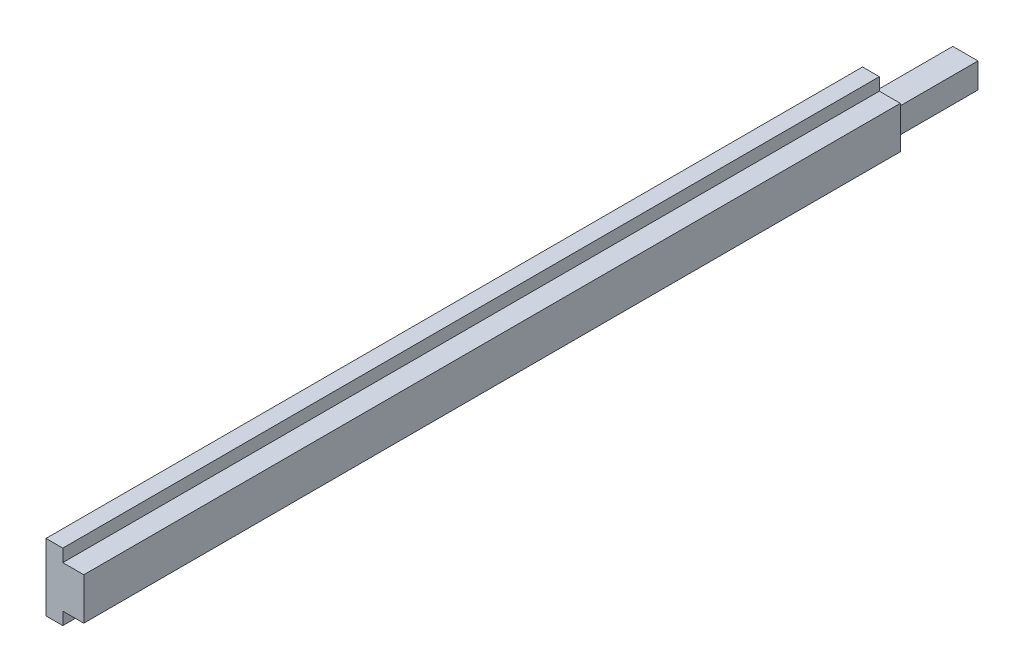
ISO-10303-21;
HEADER;
FILE_DESCRIPTION(('STEP AP214'),'2;1');
FILE_NAME('part.step','',(''),(''),'','','');
FILE_SCHEMA(('AUTOMOTIVE_DESIGN { 1 0 10303 214 1 1 1 1 }'));
ENDSEC;
DATA;
#1=APPLICATION_CONTEXT('core data for automotive mechanical design processes');
#2=APPLICATION_PROTOCOL_DEFINITION('international standard','automotive_design',2000,#1);
#3=PRODUCT_CONTEXT('',#1,'mechanical');
#4=PRODUCT('Part','Part','',(#3));
#5=PRODUCT_RELATED_PRODUCT_CATEGORY('part','',(#4));
#6=PRODUCT_DEFINITION_FORMATION('','',#4);
#7=PRODUCT_DEFINITION_CONTEXT('part definition',#1,'design');
#8=PRODUCT_DEFINITION('design','',#6,#7);
#9=PRODUCT_DEFINITION_SHAPE('','',#8);
#10=(LENGTH_UNIT() NAMED_UNIT(*) SI_UNIT(.MILLI.,.METRE.));
#11=(NAMED_UNIT(*) PLANE_ANGLE_UNIT() SI_UNIT($,.RADIAN.));
#12=(NAMED_UNIT(*) SI_UNIT($,.STERADIAN.) SOLID_ANGLE_UNIT());
#13=UNCERTAINTY_MEASURE_WITH_UNIT(LENGTH_MEASURE(1.E-05),#10,'distance_accuracy_value','');
#14=(GEOMETRIC_REPRESENTATION_CONTEXT(3) GLOBAL_UNCERTAINTY_ASSIGNED_CONTEXT((#13)) GLOBAL_UNIT_ASSIGNED_CONTEXT((#10,
#11,#12)) REPRESENTATION_CONTEXT('',''));
#15=CARTESIAN_POINT('',(0.,0.,0.));
#16=DIRECTION('',(0.,0.,1.));
#17=DIRECTION('',(1.,0.,0.));
#18=AXIS2_PLACEMENT_3D('',#15,#16,#17);
#19=CARTESIAN_POINT('',(0.,0.,-194.5));
#20=DIRECTION('',(0.,0.,1.));
#21=DIRECTION('',(1.,0.,0.));
#22=AXIS2_PLACEMENT_3D('',#19,#20,#21);
#23=PLANE('',#22);
#24=DIRECTION('',(1.,0.,0.));
#25=VECTOR('',#24,1.);
#26=CARTESIAN_POINT('',(0.,5.,-194.5));
#27=LINE('',#26,#25);
#28=CARTESIAN_POINT('',(2.,5.,-194.5));
#29=VERTEX_POINT('',#28);
#30=CARTESIAN_POINT('',(7.,5.,-194.5));
#31=VERTEX_POINT('',#30);
#32=EDGE_CURVE('E162',#29,#31,#27,.T.);
#33=ORIENTED_EDGE('',*,*,#32,.T.);
#34=DIRECTION('',(0.,1.,0.));
#35=VECTOR('',#34,1.);
#36=CARTESIAN_POINT('',(7.,0.,-194.5));
#37=LINE('',#36,#35);
#38=CARTESIAN_POINT('',(7.,-5.,-194.5));
#39=VERTEX_POINT('',#38);
#40=EDGE_CURVE('E179',#39,#31,#37,.T.);
#41=ORIENTED_EDGE('',*,*,#40,.F.);
#42=DIRECTION('',(1.,0.,0.));
#43=VECTOR('',#42,1.);
#44=CARTESIAN_POINT('',(0.,-5.,-194.5));
#45=LINE('',#44,#43);
#46=CARTESIAN_POINT('',(2.,-5.,-194.5));
#47=VERTEX_POINT('',#46);
#48=EDGE_CURVE('E176',#47,#39,#45,.T.);
#49=ORIENTED_EDGE('',*,*,#48,.F.);
#50=DIRECTION('',(0.,1.,0.));
#51=VECTOR('',#50,1.);
#52=CARTESIAN_POINT('',(2.,0.,-194.5));
#53=LINE('',#52,#51);
#54=CARTESIAN_POINT('',(2.,-8.,-194.5));
#55=VERTEX_POINT('',#54);
#56=EDGE_CURVE('E169',#55,#47,#53,.T.);
#57=ORIENTED_EDGE('',*,*,#56,.F.);
#58=DIRECTION('',(-1.,0.,0.));
#59=VECTOR('',#58,1.);
#60=CARTESIAN_POINT('',(0.,-8.,-194.5));
#61=LINE('',#60,#59);
#62=CARTESIAN_POINT('',(-2.,-8.,-194.5));
#63=VERTEX_POINT('',#62);
#64=EDGE_CURVE('E174',#55,#63,#61,.T.);
#65=ORIENTED_EDGE('',*,*,#64,.T.);
#66=DIRECTION('',(0.,1.,0.));
#67=VECTOR('',#66,1.);
#68=CARTESIAN_POINT('',(-2.,0.,-194.5));
#69=LINE('',#68,#67);
#70=CARTESIAN_POINT('',(-2.,8.,-194.5));
#71=VERTEX_POINT('',#70);
#72=EDGE_CURVE('E172',#63,#71,#69,.T.);
#73=ORIENTED_EDGE('',*,*,#72,.T.);
#74=DIRECTION('',(-1.,0.,0.));
#75=VECTOR('',#74,1.);
#76=CARTESIAN_POINT('',(0.,8.,-194.5));
#77=LINE('',#76,#75);
#78=CARTESIAN_POINT('',(2.,8.,-194.5));
#79=VERTEX_POINT('',#78);
#80=EDGE_CURVE('E168',#79,#71,#77,.T.);
#81=ORIENTED_EDGE('',*,*,#80,.F.);
#82=EDGE_CURVE('E164',#29,#79,#53,.T.);
#83=ORIENTED_EDGE('',*,*,#82,.F.);
#84=EDGE_LOOP('',(#33,#41,#49,#57,#65,#73,#81,#83));
#85=FACE_BOUND('',#84,.T.);
#86=DIRECTION('',(0.,-1.,0.));
#87=VECTOR('',#86,1.);
#88=CARTESIAN_POINT('',(5.5,3.,-194.5));
#89=LINE('',#88,#87);
#90=CARTESIAN_POINT('',(5.5,3.,-194.5));
#91=VERTEX_POINT('',#90);
#92=CARTESIAN_POINT('',(5.5,-3.,-194.5));
#93=VERTEX_POINT('',#92);
#94=EDGE_CURVE('E60',#91,#93,#89,.T.);
#95=ORIENTED_EDGE('',*,*,#94,.F.);
#96=DIRECTION('',(1.,0.,0.));
#97=VECTOR('',#96,1.);
#98=CARTESIAN_POINT('',(-0.5,3.,-194.5));
#99=LINE('',#98,#97);
#100=CARTESIAN_POINT('',(-0.5,3.,-194.5));
#101=VERTEX_POINT('',#100);
#102=EDGE_CURVE('E64',#101,#91,#99,.T.);
#103=ORIENTED_EDGE('',*,*,#102,.F.);
#104=DIRECTION('',(0.,1.,0.));
#105=VECTOR('',#104,1.);
#106=CARTESIAN_POINT('',(-0.5,3.,-194.5));
#107=LINE('',#106,#105);
#108=CARTESIAN_POINT('',(-0.500000000000001,-3.,-194.5));
#109=VERTEX_POINT('',#108);
#110=EDGE_CURVE('E353',#109,#101,#107,.T.);
#111=ORIENTED_EDGE('',*,*,#110,.F.);
#112=DIRECTION('',(-1.,0.,0.));
#113=VECTOR('',#112,1.);
#114=CARTESIAN_POINT('',(-0.500000000000001,-3.,-194.5));
#115=LINE('',#114,#113);
#116=EDGE_CURVE('E359',#93,#109,#115,.T.);
#117=ORIENTED_EDGE('',*,*,#116,.F.);
#118=EDGE_LOOP('',(#95,#103,#111,#117));
#119=FACE_BOUND('',#118,.T.);
#120=ADVANCED_FACE('F43',(#85,#119),#23,.F.);
#121=CARTESIAN_POINT('',(0.,5.,-194.5));
#122=DIRECTION('',(0.,-1.,0.));
#123=DIRECTION('',(1.,0.,0.));
#124=AXIS2_PLACEMENT_3D('',#121,#122,#123);
#125=PLANE('',#124);
#126=DIRECTION('',(1.,0.,0.));
#127=VECTOR('',#126,1.);
#128=CARTESIAN_POINT('',(0.,5.,0.));
#129=LINE('',#128,#127);
#130=CARTESIAN_POINT('',(2.,5.,0.));
#131=VERTEX_POINT('',#130);
#132=CARTESIAN_POINT('',(7.,5.,0.));
#133=VERTEX_POINT('',#132);
#134=EDGE_CURVE('E153',#131,#133,#129,.T.);
#135=ORIENTED_EDGE('',*,*,#134,.T.);
#136=DIRECTION('',(0.,0.,1.));
#137=VECTOR('',#136,1.);
#138=CARTESIAN_POINT('',(7.,5.,-194.5));
#139=LINE('',#138,#137);
#140=EDGE_CURVE('E11',#31,#133,#139,.T.);
#141=ORIENTED_EDGE('',*,*,#140,.F.);
#142=ORIENTED_EDGE('',*,*,#32,.F.);
#143=DIRECTION('',(0.,0.,1.));
#144=VECTOR('',#143,1.);
#145=CARTESIAN_POINT('',(2.,5.,-194.5));
#146=LINE('',#145,#144);
#147=EDGE_CURVE('E47',#29,#131,#146,.T.);
#148=ORIENTED_EDGE('',*,*,#147,.T.);
#149=EDGE_LOOP('',(#135,#141,#142,#148));
#150=FACE_BOUND('',#149,.T.);
#151=ADVANCED_FACE('F45',(#150),#125,.F.);
#152=CARTESIAN_POINT('',(7.,0.,-194.5));
#153=DIRECTION('',(1.,0.,0.));
#154=DIRECTION('',(0.,0.,-1.));
#155=AXIS2_PLACEMENT_3D('',#152,#153,#154);
#156=PLANE('',#155);
#157=DIRECTION('',(0.,1.,0.));
#158=VECTOR('',#157,1.);
#159=CARTESIAN_POINT('',(7.,0.,0.));
#160=LINE('',#159,#158);
#161=CARTESIAN_POINT('',(7.,-5.,0.));
#162=VERTEX_POINT('',#161);
#163=EDGE_CURVE('E165',#162,#133,#160,.T.);
#164=ORIENTED_EDGE('',*,*,#163,.F.);
#165=DIRECTION('',(0.,0.,1.));
#166=VECTOR('',#165,1.);
#167=CARTESIAN_POINT('',(7.,-5.,-194.5));
#168=LINE('',#167,#166);
#169=EDGE_CURVE('E52',#39,#162,#168,.T.);
#170=ORIENTED_EDGE('',*,*,#169,.F.);
#171=ORIENTED_EDGE('',*,*,#40,.T.);
#172=ORIENTED_EDGE('',*,*,#140,.T.);
#173=EDGE_LOOP('',(#164,#170,#171,#172));
#174=FACE_BOUND('',#173,.T.);
#175=ADVANCED_FACE('F244',(#174),#156,.T.);
#176=CARTESIAN_POINT('',(0.,-5.,-194.5));
#177=DIRECTION('',(0.,-1.,0.));
#178=DIRECTION('',(1.,0.,0.));
#179=AXIS2_PLACEMENT_3D('',#176,#177,#178);
#180=PLANE('',#179);
#181=DIRECTION('',(1.,0.,0.));
#182=VECTOR('',#181,1.);
#183=CARTESIAN_POINT('',(0.,-5.,0.));
#184=LINE('',#183,#182);
#185=CARTESIAN_POINT('',(2.,-5.,0.));
#186=VERTEX_POINT('',#185);
#187=EDGE_CURVE('E193',#186,#162,#184,.T.);
#188=ORIENTED_EDGE('',*,*,#187,.F.);
#189=DIRECTION('',(0.,0.,1.));
#190=VECTOR('',#189,1.);
#191=CARTESIAN_POINT('',(2.,-5.,-194.5));
#192=LINE('',#191,#190);
#193=EDGE_CURVE('E199',#47,#186,#192,.T.);
#194=ORIENTED_EDGE('',*,*,#193,.F.);
#195=ORIENTED_EDGE('',*,*,#48,.T.);
#196=ORIENTED_EDGE('',*,*,#169,.T.);
#197=EDGE_LOOP('',(#188,#194,#195,#196));
#198=FACE_BOUND('',#197,.T.);
#199=ADVANCED_FACE('F235',(#198),#180,.T.);
#200=CARTESIAN_POINT('',(2.,0.,-194.5));
#201=DIRECTION('',(1.,0.,0.));
#202=DIRECTION('',(0.,0.,-1.));
#203=AXIS2_PLACEMENT_3D('',#200,#201,#202);
#204=PLANE('',#203);
#205=DIRECTION('',(0.,1.,0.));
#206=VECTOR('',#205,1.);
#207=CARTESIAN_POINT('',(2.,0.,0.));
#208=LINE('',#207,#206);
#209=CARTESIAN_POINT('',(2.,-8.,0.));
#210=VERTEX_POINT('',#209);
#211=EDGE_CURVE('E185',#210,#186,#208,.T.);
#212=ORIENTED_EDGE('',*,*,#211,.F.);
#213=DIRECTION('',(0.,0.,1.));
#214=VECTOR('',#213,1.);
#215=CARTESIAN_POINT('',(2.,-8.,-194.5));
#216=LINE('',#215,#214);
#217=EDGE_CURVE('E201',#55,#210,#216,.T.);
#218=ORIENTED_EDGE('',*,*,#217,.F.);
#219=ORIENTED_EDGE('',*,*,#56,.T.);
#220=ORIENTED_EDGE('',*,*,#193,.T.);
#221=EDGE_LOOP('',(#212,#218,#219,#220));
#222=FACE_BOUND('',#221,.T.);
#223=ADVANCED_FACE('F223',(#222),#204,.T.);
#224=CARTESIAN_POINT('',(0.,-8.,-194.5));
#225=DIRECTION('',(0.,1.,0.));
#226=DIRECTION('',(0.,0.,1.));
#227=AXIS2_PLACEMENT_3D('',#224,#225,#226);
#228=PLANE('',#227);
#229=DIRECTION('',(-1.,0.,0.));
#230=VECTOR('',#229,1.);
#231=CARTESIAN_POINT('',(0.,-8.,0.));
#232=LINE('',#231,#230);
#233=CARTESIAN_POINT('',(-2.,-8.,0.));
#234=VERTEX_POINT('',#233);
#235=EDGE_CURVE('E191',#210,#234,#232,.T.);
#236=ORIENTED_EDGE('',*,*,#235,.T.);
#237=DIRECTION('',(0.,0.,1.));
#238=VECTOR('',#237,1.);
#239=CARTESIAN_POINT('',(-2.,-8.,-194.5));
#240=LINE('',#239,#238);
#241=EDGE_CURVE('E203',#63,#234,#240,.T.);
#242=ORIENTED_EDGE('',*,*,#241,.F.);
#243=ORIENTED_EDGE('',*,*,#64,.F.);
#244=ORIENTED_EDGE('',*,*,#217,.T.);
#245=EDGE_LOOP('',(#236,#242,#243,#244));
#246=FACE_BOUND('',#245,.T.);
#247=ADVANCED_FACE('F234',(#246),#228,.F.);
#248=CARTESIAN_POINT('',(-2.,0.,-194.5));
#249=DIRECTION('',(1.,0.,0.));
#250=DIRECTION('',(0.,0.,-1.));
#251=AXIS2_PLACEMENT_3D('',#248,#249,#250);
#252=PLANE('',#251);
#253=DIRECTION('',(0.,1.,0.));
#254=VECTOR('',#253,1.);
#255=CARTESIAN_POINT('',(-2.,0.,0.));
#256=LINE('',#255,#254);
#257=CARTESIAN_POINT('',(-2.,8.,0.));
#258=VERTEX_POINT('',#257);
#259=EDGE_CURVE('E188',#234,#258,#256,.T.);
#260=ORIENTED_EDGE('',*,*,#259,.T.);
#261=DIRECTION('',(0.,0.,1.));
#262=VECTOR('',#261,1.);
#263=CARTESIAN_POINT('',(-2.,8.,-194.5));
#264=LINE('',#263,#262);
#265=EDGE_CURVE('E206',#71,#258,#264,.T.);
#266=ORIENTED_EDGE('',*,*,#265,.F.);
#267=ORIENTED_EDGE('',*,*,#72,.F.);
#268=ORIENTED_EDGE('',*,*,#241,.T.);
#269=EDGE_LOOP('',(#260,#266,#267,#268));
#270=FACE_BOUND('',#269,.T.);
#271=ADVANCED_FACE('F229',(#270),#252,.F.);
#272=CARTESIAN_POINT('',(0.,8.,-194.5));
#273=DIRECTION('',(0.,1.,0.));
#274=DIRECTION('',(0.,0.,1.));
#275=AXIS2_PLACEMENT_3D('',#272,#273,#274);
#276=PLANE('',#275);
#277=DIRECTION('',(-1.,0.,0.));
#278=VECTOR('',#277,1.);
#279=CARTESIAN_POINT('',(0.,8.,0.));
#280=LINE('',#279,#278);
#281=CARTESIAN_POINT('',(2.,8.,0.));
#282=VERTEX_POINT('',#281);
#283=EDGE_CURVE('E184',#282,#258,#280,.T.);
#284=ORIENTED_EDGE('',*,*,#283,.F.);
#285=DIRECTION('',(0.,0.,1.));
#286=VECTOR('',#285,1.);
#287=CARTESIAN_POINT('',(2.,8.,-194.5));
#288=LINE('',#287,#286);
#289=EDGE_CURVE('E207',#79,#282,#288,.T.);
#290=ORIENTED_EDGE('',*,*,#289,.F.);
#291=ORIENTED_EDGE('',*,*,#80,.T.);
#292=ORIENTED_EDGE('',*,*,#265,.T.);
#293=EDGE_LOOP('',(#284,#290,#291,#292));
#294=FACE_BOUND('',#293,.T.);
#295=ADVANCED_FACE('F221',(#294),#276,.T.);
#296=EDGE_CURVE('E156',#131,#282,#208,.T.);
#297=ORIENTED_EDGE('',*,*,#296,.F.);
#298=ORIENTED_EDGE('',*,*,#147,.F.);
#299=ORIENTED_EDGE('',*,*,#82,.T.);
#300=ORIENTED_EDGE('',*,*,#289,.T.);
#301=EDGE_LOOP('',(#297,#298,#299,#300));
#302=FACE_BOUND('',#301,.T.);
#303=ADVANCED_FACE('F219',(#302),#204,.T.);
#304=CARTESIAN_POINT('',(0.,0.,0.));
#305=DIRECTION('',(0.,0.,1.));
#306=DIRECTION('',(1.,0.,0.));
#307=AXIS2_PLACEMENT_3D('',#304,#305,#306);
#308=PLANE('',#307);
#309=ORIENTED_EDGE('',*,*,#134,.F.);
#310=ORIENTED_EDGE('',*,*,#296,.T.);
#311=ORIENTED_EDGE('',*,*,#283,.T.);
#312=ORIENTED_EDGE('',*,*,#259,.F.);
#313=ORIENTED_EDGE('',*,*,#235,.F.);
#314=ORIENTED_EDGE('',*,*,#211,.T.);
#315=ORIENTED_EDGE('',*,*,#187,.T.);
#316=ORIENTED_EDGE('',*,*,#163,.T.);
#317=EDGE_LOOP('',(#309,#310,#311,#312,#313,#314,#315,#316));
#318=FACE_BOUND('',#317,.T.);
#319=ADVANCED_FACE('F217',(#318),#308,.T.);
#320=CARTESIAN_POINT('',(5.5,3.,-214.5));
#321=DIRECTION('',(-1.,0.,0.));
#322=DIRECTION('',(0.,0.,1.));
#323=AXIS2_PLACEMENT_3D('',#320,#321,#322);
#324=PLANE('',#323);
#325=ORIENTED_EDGE('',*,*,#94,.T.);
#326=DIRECTION('',(0.,0.,1.));
#327=VECTOR('',#326,1.);
#328=CARTESIAN_POINT('',(5.5,-3.,-214.5));
#329=LINE('',#328,#327);
#330=CARTESIAN_POINT('',(5.5,-3.,-214.5));
#331=VERTEX_POINT('',#330);
#332=EDGE_CURVE('E136',#331,#93,#329,.T.);
#333=ORIENTED_EDGE('',*,*,#332,.F.);
#334=DIRECTION('',(0.,-1.,0.));
#335=VECTOR('',#334,1.);
#336=CARTESIAN_POINT('',(5.5,3.,-214.5));
#337=LINE('',#336,#335);
#338=CARTESIAN_POINT('',(5.5,3.,-214.5));
#339=VERTEX_POINT('',#338);
#340=EDGE_CURVE('E142',#339,#331,#337,.T.);
#341=ORIENTED_EDGE('',*,*,#340,.F.);
#342=DIRECTION('',(0.,0.,1.));
#343=VECTOR('',#342,1.);
#344=CARTESIAN_POINT('',(5.5,3.,-214.5));
#345=LINE('',#344,#343);
#346=EDGE_CURVE('E351',#339,#91,#345,.T.);
#347=ORIENTED_EDGE('',*,*,#346,.T.);
#348=EDGE_LOOP('',(#325,#333,#341,#347));
#349=FACE_BOUND('',#348,.T.);
#350=ADVANCED_FACE('F152',(#349),#324,.F.);
#351=CARTESIAN_POINT('',(-0.500000000000001,-3.,-214.5));
#352=DIRECTION('',(0.,1.,0.));
#353=DIRECTION('',(0.,0.,1.));
#354=AXIS2_PLACEMENT_3D('',#351,#352,#353);
#355=PLANE('',#354);
#356=ORIENTED_EDGE('',*,*,#116,.T.);
#357=DIRECTION('',(0.,0.,1.));
#358=VECTOR('',#357,1.);
#359=CARTESIAN_POINT('',(-0.500000000000001,-3.,-214.5));
#360=LINE('',#359,#358);
#361=CARTESIAN_POINT('',(-0.500000000000001,-3.,-214.5));
#362=VERTEX_POINT('',#361);
#363=EDGE_CURVE('E138',#362,#109,#360,.T.);
#364=ORIENTED_EDGE('',*,*,#363,.F.);
#365=DIRECTION('',(-1.,0.,0.));
#366=VECTOR('',#365,1.);
#367=CARTESIAN_POINT('',(-0.500000000000001,-3.,-214.5));
#368=LINE('',#367,#366);
#369=EDGE_CURVE('E131',#331,#362,#368,.T.);
#370=ORIENTED_EDGE('',*,*,#369,.F.);
#371=ORIENTED_EDGE('',*,*,#332,.T.);
#372=EDGE_LOOP('',(#356,#364,#370,#371));
#373=FACE_BOUND('',#372,.T.);
#374=ADVANCED_FACE('F134',(#373),#355,.F.);
#375=CARTESIAN_POINT('',(-0.5,3.,-214.5));
#376=DIRECTION('',(1.,0.,0.));
#377=DIRECTION('',(0.,1.,0.));
#378=AXIS2_PLACEMENT_3D('',#375,#376,#377);
#379=PLANE('',#378);
#380=ORIENTED_EDGE('',*,*,#110,.T.);
#381=DIRECTION('',(0.,0.,1.));
#382=VECTOR('',#381,1.);
#383=CARTESIAN_POINT('',(-0.5,3.,-214.5));
#384=LINE('',#383,#382);
#385=CARTESIAN_POINT('',(-0.5,3.,-214.5));
#386=VERTEX_POINT('',#385);
#387=EDGE_CURVE('E158',#386,#101,#384,.T.);
#388=ORIENTED_EDGE('',*,*,#387,.F.);
#389=DIRECTION('',(0.,1.,0.));
#390=VECTOR('',#389,1.);
#391=CARTESIAN_POINT('',(-0.5,3.,-214.5));
#392=LINE('',#391,#390);
#393=EDGE_CURVE('E141',#362,#386,#392,.T.);
#394=ORIENTED_EDGE('',*,*,#393,.F.);
#395=ORIENTED_EDGE('',*,*,#363,.T.);
#396=EDGE_LOOP('',(#380,#388,#394,#395));
#397=FACE_BOUND('',#396,.T.);
#398=ADVANCED_FACE('F321',(#397),#379,.F.);
#399=CARTESIAN_POINT('',(-0.5,3.,-214.5));
#400=DIRECTION('',(0.,-1.,0.));
#401=DIRECTION('',(0.,0.,-1.));
#402=AXIS2_PLACEMENT_3D('',#399,#400,#401);
#403=PLANE('',#402);
#404=ORIENTED_EDGE('',*,*,#102,.T.);
#405=ORIENTED_EDGE('',*,*,#346,.F.);
#406=DIRECTION('',(1.,0.,0.));
#407=VECTOR('',#406,1.);
#408=CARTESIAN_POINT('',(-0.5,3.,-214.5));
#409=LINE('',#408,#407);
#410=EDGE_CURVE('E147',#386,#339,#409,.T.);
#411=ORIENTED_EDGE('',*,*,#410,.F.);
#412=ORIENTED_EDGE('',*,*,#387,.T.);
#413=EDGE_LOOP('',(#404,#405,#411,#412));
#414=FACE_BOUND('',#413,.T.);
#415=ADVANCED_FACE('F329',(#414),#403,.F.);
#416=CARTESIAN_POINT('',(0.,0.,-214.5));
#417=DIRECTION('',(0.,0.,1.));
#418=DIRECTION('',(1.,0.,0.));
#419=AXIS2_PLACEMENT_3D('',#416,#417,#418);
#420=PLANE('',#419);
#421=ORIENTED_EDGE('',*,*,#340,.T.);
#422=ORIENTED_EDGE('',*,*,#369,.T.);
#423=ORIENTED_EDGE('',*,*,#393,.T.);
#424=ORIENTED_EDGE('',*,*,#410,.T.);
#425=EDGE_LOOP('',(#421,#422,#423,#424));
#426=FACE_BOUND('',#425,.T.);
#427=ADVANCED_FACE('F145',(#426),#420,.F.);
#428=CLOSED_SHELL('',(#120,#151,#175,#199,#223,#247,#271,#295,#303,#319,#350,#374,#398,#415,#427));
#429=MANIFOLD_SOLID_BREP('B2',#428);
#430=ADVANCED_BREP_SHAPE_REPRESENTATION('',(#18,#429),#14);
#431=SHAPE_DEFINITION_REPRESENTATION(#9,#430);
ENDSEC;
END-ISO-10303-21;
